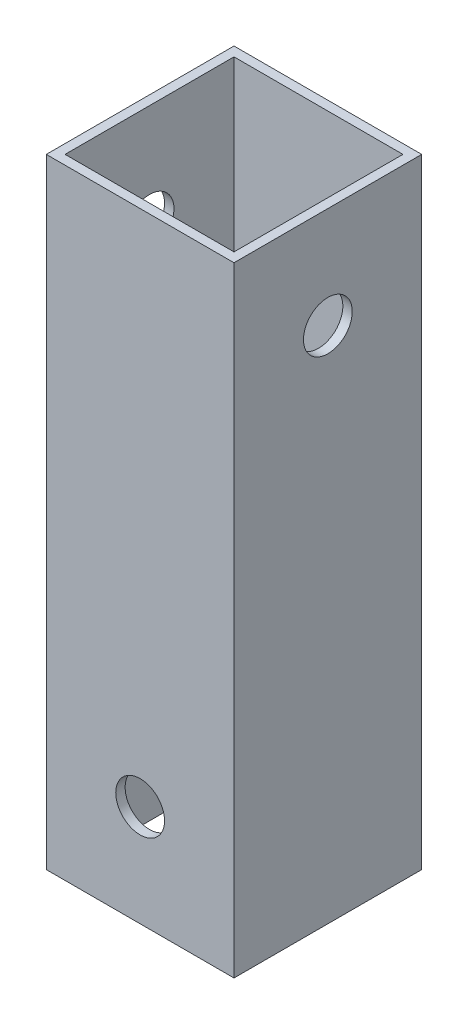
ISO-10303-21;
HEADER;
FILE_DESCRIPTION(('STEP AP214'),'2;1');
FILE_NAME('part.step','',(''),(''),'','','');
FILE_SCHEMA(('AUTOMOTIVE_DESIGN { 1 0 10303 214 1 1 1 1 }'));
ENDSEC;
DATA;
#1=APPLICATION_CONTEXT('core data for automotive mechanical design processes');
#2=APPLICATION_PROTOCOL_DEFINITION('international standard','automotive_design',2000,#1);
#3=PRODUCT_CONTEXT('',#1,'mechanical');
#4=PRODUCT('Part','Part','',(#3));
#5=PRODUCT_RELATED_PRODUCT_CATEGORY('part','',(#4));
#6=PRODUCT_DEFINITION_FORMATION('','',#4);
#7=PRODUCT_DEFINITION_CONTEXT('part definition',#1,'design');
#8=PRODUCT_DEFINITION('design','',#6,#7);
#9=PRODUCT_DEFINITION_SHAPE('','',#8);
#10=(LENGTH_UNIT() NAMED_UNIT(*) SI_UNIT(.MILLI.,.METRE.));
#11=(NAMED_UNIT(*) PLANE_ANGLE_UNIT() SI_UNIT($,.RADIAN.));
#12=(NAMED_UNIT(*) SI_UNIT($,.STERADIAN.) SOLID_ANGLE_UNIT());
#13=UNCERTAINTY_MEASURE_WITH_UNIT(LENGTH_MEASURE(1.E-05),#10,'distance_accuracy_value','');
#14=(GEOMETRIC_REPRESENTATION_CONTEXT(3) GLOBAL_UNCERTAINTY_ASSIGNED_CONTEXT((#13)) GLOBAL_UNIT_ASSIGNED_CONTEXT((#10,
#11,#12)) REPRESENTATION_CONTEXT('',''));
#15=CARTESIAN_POINT('',(0.,0.,0.));
#16=DIRECTION('',(0.,0.,1.));
#17=DIRECTION('',(1.,0.,0.));
#18=AXIS2_PLACEMENT_3D('',#15,#16,#17);
#19=CARTESIAN_POINT('',(0.,66.,0.));
#20=DIRECTION('',(0.,-1.,0.));
#21=DIRECTION('',(0.,0.,-1.));
#22=AXIS2_PLACEMENT_3D('',#19,#20,#21);
#23=PLANE('',#22);
#24=DIRECTION('',(0.,0.,1.));
#25=VECTOR('',#24,1.);
#26=CARTESIAN_POINT('',(0.,66.,0.));
#27=LINE('',#26,#25);
#28=CARTESIAN_POINT('',(0.,66.,-20.));
#29=VERTEX_POINT('',#28);
#30=CARTESIAN_POINT('',(0.,66.,0.));
#31=VERTEX_POINT('',#30);
#32=EDGE_CURVE('E163',#29,#31,#27,.T.);
#33=ORIENTED_EDGE('',*,*,#32,.T.);
#34=DIRECTION('',(1.,0.,0.));
#35=VECTOR('',#34,1.);
#36=CARTESIAN_POINT('',(0.,66.,0.));
#37=LINE('',#36,#35);
#38=CARTESIAN_POINT('',(20.,66.,0.));
#39=VERTEX_POINT('',#38);
#40=EDGE_CURVE('E167',#31,#39,#37,.T.);
#41=ORIENTED_EDGE('',*,*,#40,.T.);
#42=DIRECTION('',(0.,0.,-1.));
#43=VECTOR('',#42,1.);
#44=CARTESIAN_POINT('',(20.,66.,0.));
#45=LINE('',#44,#43);
#46=CARTESIAN_POINT('',(20.,66.,-20.));
#47=VERTEX_POINT('',#46);
#48=EDGE_CURVE('E171',#39,#47,#45,.T.);
#49=ORIENTED_EDGE('',*,*,#48,.T.);
#50=DIRECTION('',(-1.,0.,0.));
#51=VECTOR('',#50,1.);
#52=CARTESIAN_POINT('',(0.,66.,-20.));
#53=LINE('',#52,#51);
#54=EDGE_CURVE('E174',#47,#29,#53,.T.);
#55=ORIENTED_EDGE('',*,*,#54,.T.);
#56=EDGE_LOOP('',(#33,#41,#49,#55));
#57=FACE_BOUND('',#56,.T.);
#58=DIRECTION('',(0.,0.,1.));
#59=VECTOR('',#58,1.);
#60=CARTESIAN_POINT('',(1.,66.,-1.));
#61=LINE('',#60,#59);
#62=CARTESIAN_POINT('',(1.,66.,-19.));
#63=VERTEX_POINT('',#62);
#64=CARTESIAN_POINT('',(1.,66.,-1.));
#65=VERTEX_POINT('',#64);
#66=EDGE_CURVE('E113',#63,#65,#61,.T.);
#67=ORIENTED_EDGE('',*,*,#66,.F.);
#68=DIRECTION('',(-1.,0.,0.));
#69=VECTOR('',#68,1.);
#70=CARTESIAN_POINT('',(1.,66.,-19.));
#71=LINE('',#70,#69);
#72=CARTESIAN_POINT('',(19.,66.,-19.));
#73=VERTEX_POINT('',#72);
#74=EDGE_CURVE('E139',#73,#63,#71,.T.);
#75=ORIENTED_EDGE('',*,*,#74,.F.);
#76=DIRECTION('',(0.,0.,-1.));
#77=VECTOR('',#76,1.);
#78=CARTESIAN_POINT('',(19.,66.,-1.));
#79=LINE('',#78,#77);
#80=CARTESIAN_POINT('',(19.,66.,-1.));
#81=VERTEX_POINT('',#80);
#82=EDGE_CURVE('E135',#81,#73,#79,.T.);
#83=ORIENTED_EDGE('',*,*,#82,.F.);
#84=DIRECTION('',(1.,0.,0.));
#85=VECTOR('',#84,1.);
#86=CARTESIAN_POINT('',(1.,66.,-1.));
#87=LINE('',#86,#85);
#88=EDGE_CURVE('E122',#65,#81,#87,.T.);
#89=ORIENTED_EDGE('',*,*,#88,.F.);
#90=EDGE_LOOP('',(#67,#75,#83,#89));
#91=FACE_BOUND('',#90,.T.);
#92=ADVANCED_FACE('F45',(#57,#91),#23,.F.);
#93=CARTESIAN_POINT('',(0.,0.,0.));
#94=DIRECTION('',(0.,-1.,0.));
#95=DIRECTION('',(0.,0.,-1.));
#96=AXIS2_PLACEMENT_3D('',#93,#94,#95);
#97=PLANE('',#96);
#98=DIRECTION('',(0.,0.,1.));
#99=VECTOR('',#98,1.);
#100=CARTESIAN_POINT('',(0.,0.,0.));
#101=LINE('',#100,#99);
#102=CARTESIAN_POINT('',(0.,0.,-20.));
#103=VERTEX_POINT('',#102);
#104=CARTESIAN_POINT('',(0.,0.,0.));
#105=VERTEX_POINT('',#104);
#106=EDGE_CURVE('E131',#103,#105,#101,.T.);
#107=ORIENTED_EDGE('',*,*,#106,.F.);
#108=DIRECTION('',(-1.,0.,0.));
#109=VECTOR('',#108,1.);
#110=CARTESIAN_POINT('',(0.,0.,-20.));
#111=LINE('',#110,#109);
#112=CARTESIAN_POINT('',(20.,0.,-20.));
#113=VERTEX_POINT('',#112);
#114=EDGE_CURVE('E168',#113,#103,#111,.T.);
#115=ORIENTED_EDGE('',*,*,#114,.F.);
#116=DIRECTION('',(0.,0.,-1.));
#117=VECTOR('',#116,1.);
#118=CARTESIAN_POINT('',(20.,0.,0.));
#119=LINE('',#118,#117);
#120=CARTESIAN_POINT('',(20.,0.,0.));
#121=VERTEX_POINT('',#120);
#122=EDGE_CURVE('E184',#121,#113,#119,.T.);
#123=ORIENTED_EDGE('',*,*,#122,.F.);
#124=DIRECTION('',(1.,0.,0.));
#125=VECTOR('',#124,1.);
#126=CARTESIAN_POINT('',(0.,0.,0.));
#127=LINE('',#126,#125);
#128=EDGE_CURVE('E181',#105,#121,#127,.T.);
#129=ORIENTED_EDGE('',*,*,#128,.F.);
#130=EDGE_LOOP('',(#107,#115,#123,#129));
#131=FACE_BOUND('',#130,.T.);
#132=DIRECTION('',(-1.,0.,0.));
#133=VECTOR('',#132,1.);
#134=CARTESIAN_POINT('',(1.,0.,-19.));
#135=LINE('',#134,#133);
#136=CARTESIAN_POINT('',(19.,0.,-19.));
#137=VERTEX_POINT('',#136);
#138=CARTESIAN_POINT('',(1.,0.,-19.));
#139=VERTEX_POINT('',#138);
#140=EDGE_CURVE('E123',#137,#139,#135,.T.);
#141=ORIENTED_EDGE('',*,*,#140,.T.);
#142=DIRECTION('',(0.,0.,1.));
#143=VECTOR('',#142,1.);
#144=CARTESIAN_POINT('',(1.,0.,-1.));
#145=LINE('',#144,#143);
#146=CARTESIAN_POINT('',(1.,0.,-1.));
#147=VERTEX_POINT('',#146);
#148=EDGE_CURVE('E71',#139,#147,#145,.T.);
#149=ORIENTED_EDGE('',*,*,#148,.T.);
#150=DIRECTION('',(1.,0.,0.));
#151=VECTOR('',#150,1.);
#152=CARTESIAN_POINT('',(1.,0.,-1.));
#153=LINE('',#152,#151);
#154=CARTESIAN_POINT('',(19.,0.,-1.));
#155=VERTEX_POINT('',#154);
#156=EDGE_CURVE('E129',#147,#155,#153,.T.);
#157=ORIENTED_EDGE('',*,*,#156,.T.);
#158=DIRECTION('',(0.,0.,-1.));
#159=VECTOR('',#158,1.);
#160=CARTESIAN_POINT('',(19.,0.,-1.));
#161=LINE('',#160,#159);
#162=EDGE_CURVE('E150',#155,#137,#161,.T.);
#163=ORIENTED_EDGE('',*,*,#162,.T.);
#164=EDGE_LOOP('',(#141,#149,#157,#163));
#165=FACE_BOUND('',#164,.T.);
#166=ADVANCED_FACE('F242',(#131,#165),#97,.T.);
#167=CARTESIAN_POINT('',(0.,66.,0.));
#168=DIRECTION('',(1.,0.,0.));
#169=DIRECTION('',(0.,0.,-1.));
#170=AXIS2_PLACEMENT_3D('',#167,#168,#169);
#171=PLANE('',#170);
#172=CARTESIAN_POINT('',(0.,55.2,-10.));
#173=DIRECTION('',(1.,0.,0.));
#174=DIRECTION('',(0.,0.,-1.));
#175=AXIS2_PLACEMENT_3D('',#172,#173,#174);
#176=CIRCLE('',#175,2.6);
#177=CARTESIAN_POINT('',(0.,55.2,-12.6));
#178=VERTEX_POINT('',#177);
#179=EDGE_CURVE('E147',#178,#178,#176,.T.);
#180=ORIENTED_EDGE('',*,*,#179,.T.);
#181=EDGE_LOOP('',(#180));
#182=FACE_BOUND('',#181,.T.);
#183=ORIENTED_EDGE('',*,*,#106,.T.);
#184=DIRECTION('',(0.,-1.,0.));
#185=VECTOR('',#184,1.);
#186=CARTESIAN_POINT('',(0.,66.,0.));
#187=LINE('',#186,#185);
#188=EDGE_CURVE('E11',#31,#105,#187,.T.);
#189=ORIENTED_EDGE('',*,*,#188,.F.);
#190=ORIENTED_EDGE('',*,*,#32,.F.);
#191=DIRECTION('',(0.,-1.,0.));
#192=VECTOR('',#191,1.);
#193=CARTESIAN_POINT('',(0.,66.,-20.));
#194=LINE('',#193,#192);
#195=EDGE_CURVE('E177',#29,#103,#194,.T.);
#196=ORIENTED_EDGE('',*,*,#195,.T.);
#197=EDGE_LOOP('',(#183,#189,#190,#196));
#198=FACE_BOUND('',#197,.T.);
#199=ADVANCED_FACE('F47',(#182,#198),#171,.F.);
#200=CARTESIAN_POINT('',(0.,66.,0.));
#201=DIRECTION('',(0.,0.,-1.));
#202=DIRECTION('',(-1.,0.,0.));
#203=AXIS2_PLACEMENT_3D('',#200,#201,#202);
#204=PLANE('',#203);
#205=CARTESIAN_POINT('',(10.,10.8,0.));
#206=DIRECTION('',(0.,0.,-1.));
#207=DIRECTION('',(-1.,0.,0.));
#208=AXIS2_PLACEMENT_3D('',#205,#206,#207);
#209=CIRCLE('',#208,2.6);
#210=CARTESIAN_POINT('',(7.4,10.8,0.));
#211=VERTEX_POINT('',#210);
#212=EDGE_CURVE('E210',#211,#211,#209,.T.);
#213=ORIENTED_EDGE('',*,*,#212,.T.);
#214=EDGE_LOOP('',(#213));
#215=FACE_BOUND('',#214,.T.);
#216=ORIENTED_EDGE('',*,*,#128,.T.);
#217=DIRECTION('',(0.,-1.,0.));
#218=VECTOR('',#217,1.);
#219=CARTESIAN_POINT('',(20.,66.,0.));
#220=LINE('',#219,#218);
#221=EDGE_CURVE('E55',#39,#121,#220,.T.);
#222=ORIENTED_EDGE('',*,*,#221,.F.);
#223=ORIENTED_EDGE('',*,*,#40,.F.);
#224=ORIENTED_EDGE('',*,*,#188,.T.);
#225=EDGE_LOOP('',(#216,#222,#223,#224));
#226=FACE_BOUND('',#225,.T.);
#227=ADVANCED_FACE('F259',(#215,#226),#204,.F.);
#228=CARTESIAN_POINT('',(20.,66.,0.));
#229=DIRECTION('',(-1.,0.,0.));
#230=DIRECTION('',(0.,0.,1.));
#231=AXIS2_PLACEMENT_3D('',#228,#229,#230);
#232=PLANE('',#231);
#233=CARTESIAN_POINT('',(20.,55.2,-10.));
#234=DIRECTION('',(1.,0.,0.));
#235=DIRECTION('',(0.,0.,-1.));
#236=AXIS2_PLACEMENT_3D('',#233,#234,#235);
#237=CIRCLE('',#236,2.6);
#238=CARTESIAN_POINT('',(20.,55.2,-12.6));
#239=VERTEX_POINT('',#238);
#240=EDGE_CURVE('E202',#239,#239,#237,.T.);
#241=ORIENTED_EDGE('',*,*,#240,.F.);
#242=EDGE_LOOP('',(#241));
#243=FACE_BOUND('',#242,.T.);
#244=ORIENTED_EDGE('',*,*,#122,.T.);
#245=DIRECTION('',(0.,-1.,0.));
#246=VECTOR('',#245,1.);
#247=CARTESIAN_POINT('',(20.,66.,-20.));
#248=LINE('',#247,#246);
#249=EDGE_CURVE('E192',#47,#113,#248,.T.);
#250=ORIENTED_EDGE('',*,*,#249,.F.);
#251=ORIENTED_EDGE('',*,*,#48,.F.);
#252=ORIENTED_EDGE('',*,*,#221,.T.);
#253=EDGE_LOOP('',(#244,#250,#251,#252));
#254=FACE_BOUND('',#253,.T.);
#255=ADVANCED_FACE('F256',(#243,#254),#232,.F.);
#256=CARTESIAN_POINT('',(0.,66.,-20.));
#257=DIRECTION('',(0.,0.,1.));
#258=DIRECTION('',(1.,0.,0.));
#259=AXIS2_PLACEMENT_3D('',#256,#257,#258);
#260=PLANE('',#259);
#261=CARTESIAN_POINT('',(10.,10.8,-20.));
#262=DIRECTION('',(0.,0.,-1.));
#263=DIRECTION('',(-1.,0.,0.));
#264=AXIS2_PLACEMENT_3D('',#261,#262,#263);
#265=CIRCLE('',#264,2.6);
#266=CARTESIAN_POINT('',(7.4,10.8,-20.));
#267=VERTEX_POINT('',#266);
#268=EDGE_CURVE('E302',#267,#267,#265,.T.);
#269=ORIENTED_EDGE('',*,*,#268,.F.);
#270=EDGE_LOOP('',(#269));
#271=FACE_BOUND('',#270,.T.);
#272=ORIENTED_EDGE('',*,*,#114,.T.);
#273=ORIENTED_EDGE('',*,*,#195,.F.);
#274=ORIENTED_EDGE('',*,*,#54,.F.);
#275=ORIENTED_EDGE('',*,*,#249,.T.);
#276=EDGE_LOOP('',(#272,#273,#274,#275));
#277=FACE_BOUND('',#276,.T.);
#278=ADVANCED_FACE('F253',(#271,#277),#260,.F.);
#279=CARTESIAN_POINT('',(1.,66.,-1.));
#280=DIRECTION('',(1.,0.,0.));
#281=DIRECTION('',(0.,0.,-1.));
#282=AXIS2_PLACEMENT_3D('',#279,#280,#281);
#283=PLANE('',#282);
#284=CARTESIAN_POINT('',(1.,55.2,-10.));
#285=DIRECTION('',(1.,0.,0.));
#286=DIRECTION('',(0.,0.,-1.));
#287=AXIS2_PLACEMENT_3D('',#284,#285,#286);
#288=CIRCLE('',#287,2.6);
#289=CARTESIAN_POINT('',(1.,55.2,-12.6));
#290=VERTEX_POINT('',#289);
#291=EDGE_CURVE('E201',#290,#290,#288,.T.);
#292=ORIENTED_EDGE('',*,*,#291,.F.);
#293=EDGE_LOOP('',(#292));
#294=FACE_BOUND('',#293,.T.);
#295=ORIENTED_EDGE('',*,*,#148,.F.);
#296=DIRECTION('',(0.,-1.,0.));
#297=VECTOR('',#296,1.);
#298=CARTESIAN_POINT('',(1.,66.,-19.));
#299=LINE('',#298,#297);
#300=EDGE_CURVE('E117',#63,#139,#299,.T.);
#301=ORIENTED_EDGE('',*,*,#300,.F.);
#302=ORIENTED_EDGE('',*,*,#66,.T.);
#303=DIRECTION('',(0.,-1.,0.));
#304=VECTOR('',#303,1.);
#305=CARTESIAN_POINT('',(1.,66.,-1.));
#306=LINE('',#305,#304);
#307=EDGE_CURVE('E116',#65,#147,#306,.T.);
#308=ORIENTED_EDGE('',*,*,#307,.T.);
#309=EDGE_LOOP('',(#295,#301,#302,#308));
#310=FACE_BOUND('',#309,.T.);
#311=ADVANCED_FACE('F115',(#294,#310),#283,.T.);
#312=CARTESIAN_POINT('',(1.,66.,-1.));
#313=DIRECTION('',(0.,0.,-1.));
#314=DIRECTION('',(-1.,0.,0.));
#315=AXIS2_PLACEMENT_3D('',#312,#313,#314);
#316=PLANE('',#315);
#317=CARTESIAN_POINT('',(10.,10.8,-1.));
#318=DIRECTION('',(0.,0.,-1.));
#319=DIRECTION('',(-1.,0.,0.));
#320=AXIS2_PLACEMENT_3D('',#317,#318,#319);
#321=CIRCLE('',#320,2.6);
#322=CARTESIAN_POINT('',(7.4,10.8,-1.));
#323=VERTEX_POINT('',#322);
#324=EDGE_CURVE('E216',#323,#323,#321,.T.);
#325=ORIENTED_EDGE('',*,*,#324,.F.);
#326=EDGE_LOOP('',(#325));
#327=FACE_BOUND('',#326,.T.);
#328=ORIENTED_EDGE('',*,*,#156,.F.);
#329=ORIENTED_EDGE('',*,*,#307,.F.);
#330=ORIENTED_EDGE('',*,*,#88,.T.);
#331=DIRECTION('',(0.,-1.,0.));
#332=VECTOR('',#331,1.);
#333=CARTESIAN_POINT('',(19.,66.,-1.));
#334=LINE('',#333,#332);
#335=EDGE_CURVE('E132',#81,#155,#334,.T.);
#336=ORIENTED_EDGE('',*,*,#335,.T.);
#337=EDGE_LOOP('',(#328,#329,#330,#336));
#338=FACE_BOUND('',#337,.T.);
#339=ADVANCED_FACE('F126',(#327,#338),#316,.T.);
#340=CARTESIAN_POINT('',(19.,66.,-1.));
#341=DIRECTION('',(-1.,0.,0.));
#342=DIRECTION('',(0.,0.,1.));
#343=AXIS2_PLACEMENT_3D('',#340,#341,#342);
#344=PLANE('',#343);
#345=CARTESIAN_POINT('',(19.,55.2,-10.));
#346=DIRECTION('',(-1.,0.,0.));
#347=DIRECTION('',(0.,0.,1.));
#348=AXIS2_PLACEMENT_3D('',#345,#346,#347);
#349=CIRCLE('',#348,2.6);
#350=CARTESIAN_POINT('',(19.,55.2,-7.4));
#351=VERTEX_POINT('',#350);
#352=EDGE_CURVE('E198',#351,#351,#349,.T.);
#353=ORIENTED_EDGE('',*,*,#352,.F.);
#354=EDGE_LOOP('',(#353));
#355=FACE_BOUND('',#354,.T.);
#356=ORIENTED_EDGE('',*,*,#162,.F.);
#357=ORIENTED_EDGE('',*,*,#335,.F.);
#358=ORIENTED_EDGE('',*,*,#82,.T.);
#359=DIRECTION('',(0.,-1.,0.));
#360=VECTOR('',#359,1.);
#361=CARTESIAN_POINT('',(19.,66.,-19.));
#362=LINE('',#361,#360);
#363=EDGE_CURVE('E63',#73,#137,#362,.T.);
#364=ORIENTED_EDGE('',*,*,#363,.T.);
#365=EDGE_LOOP('',(#356,#357,#358,#364));
#366=FACE_BOUND('',#365,.T.);
#367=ADVANCED_FACE('F282',(#355,#366),#344,.T.);
#368=CARTESIAN_POINT('',(1.,66.,-19.));
#369=DIRECTION('',(0.,0.,1.));
#370=DIRECTION('',(1.,0.,0.));
#371=AXIS2_PLACEMENT_3D('',#368,#369,#370);
#372=PLANE('',#371);
#373=CARTESIAN_POINT('',(10.,10.8,-19.));
#374=DIRECTION('',(0.,0.,1.));
#375=DIRECTION('',(1.,0.,0.));
#376=AXIS2_PLACEMENT_3D('',#373,#374,#375);
#377=CIRCLE('',#376,2.6);
#378=CARTESIAN_POINT('',(12.6,10.8,-19.));
#379=VERTEX_POINT('',#378);
#380=EDGE_CURVE('E49',#379,#379,#377,.T.);
#381=ORIENTED_EDGE('',*,*,#380,.F.);
#382=EDGE_LOOP('',(#381));
#383=FACE_BOUND('',#382,.T.);
#384=ORIENTED_EDGE('',*,*,#140,.F.);
#385=ORIENTED_EDGE('',*,*,#363,.F.);
#386=ORIENTED_EDGE('',*,*,#74,.T.);
#387=ORIENTED_EDGE('',*,*,#300,.T.);
#388=EDGE_LOOP('',(#384,#385,#386,#387));
#389=FACE_BOUND('',#388,.T.);
#390=ADVANCED_FACE('F239',(#383,#389),#372,.T.);
#391=CARTESIAN_POINT('',(-46.,55.2,-10.));
#392=DIRECTION('',(1.,0.,0.));
#393=DIRECTION('',(0.,0.,-1.));
#394=AXIS2_PLACEMENT_3D('',#391,#392,#393);
#395=CYLINDRICAL_SURFACE('',#394,2.6);
#396=ORIENTED_EDGE('',*,*,#352,.T.);
#397=EDGE_LOOP('',(#396));
#398=FACE_BOUND('',#397,.T.);
#399=ORIENTED_EDGE('',*,*,#240,.T.);
#400=EDGE_LOOP('',(#399));
#401=FACE_BOUND('',#400,.T.);
#402=ADVANCED_FACE('F228',(#398,#401),#395,.F.);
#403=ORIENTED_EDGE('',*,*,#291,.T.);
#404=EDGE_LOOP('',(#403));
#405=FACE_BOUND('',#404,.T.);
#406=ORIENTED_EDGE('',*,*,#179,.F.);
#407=EDGE_LOOP('',(#406));
#408=FACE_BOUND('',#407,.T.);
#409=ADVANCED_FACE('F225',(#405,#408),#395,.F.);
#410=CARTESIAN_POINT('',(10.,10.8,46.));
#411=DIRECTION('',(0.,0.,-1.));
#412=DIRECTION('',(-1.,0.,0.));
#413=AXIS2_PLACEMENT_3D('',#410,#411,#412);
#414=CYLINDRICAL_SURFACE('',#413,2.6);
#415=ORIENTED_EDGE('',*,*,#380,.T.);
#416=EDGE_LOOP('',(#415));
#417=FACE_BOUND('',#416,.T.);
#418=ORIENTED_EDGE('',*,*,#268,.T.);
#419=EDGE_LOOP('',(#418));
#420=FACE_BOUND('',#419,.T.);
#421=ADVANCED_FACE('F227',(#417,#420),#414,.F.);
#422=ORIENTED_EDGE('',*,*,#324,.T.);
#423=EDGE_LOOP('',(#422));
#424=FACE_BOUND('',#423,.T.);
#425=ORIENTED_EDGE('',*,*,#212,.F.);
#426=EDGE_LOOP('',(#425));
#427=FACE_BOUND('',#426,.T.);
#428=ADVANCED_FACE('F236',(#424,#427),#414,.F.);
#429=CLOSED_SHELL('',(#92,#166,#199,#227,#255,#278,#311,#339,#367,#390,#402,#409,#421,#428));
#430=MANIFOLD_SOLID_BREP('B2',#429);
#431=ADVANCED_BREP_SHAPE_REPRESENTATION('',(#18,#430),#14);
#432=SHAPE_DEFINITION_REPRESENTATION(#9,#431);
ENDSEC;
END-ISO-10303-21;
